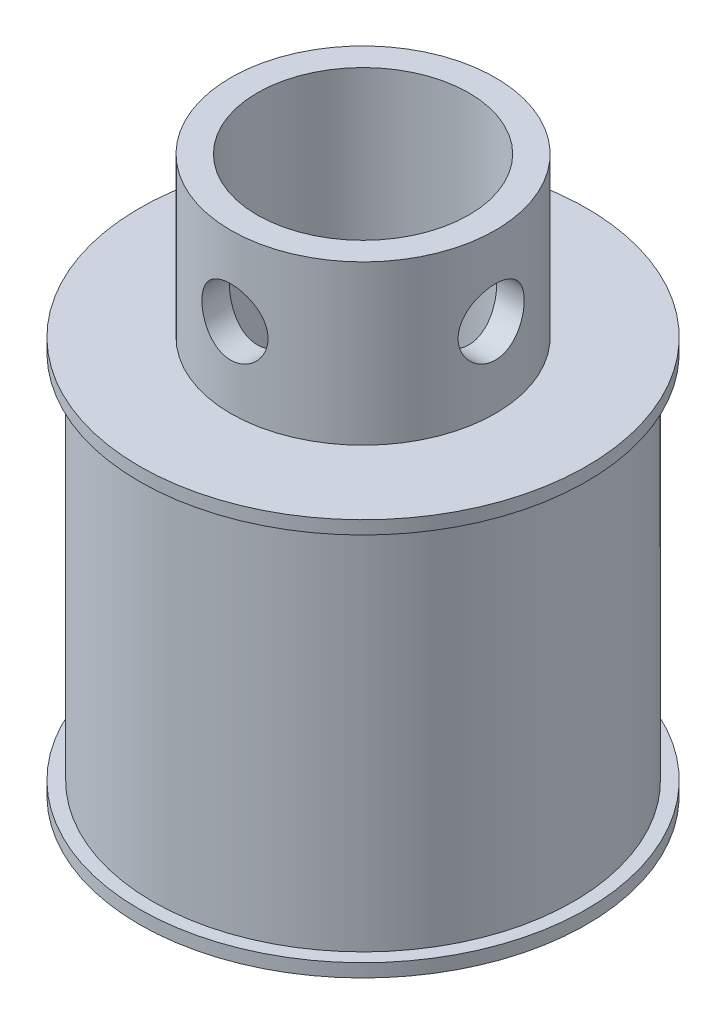
ISO-10303-21;
HEADER;
FILE_DESCRIPTION(('STEP AP214'),'2;1');
FILE_NAME('part.step','',(''),(''),'','','');
FILE_SCHEMA(('AUTOMOTIVE_DESIGN { 1 0 10303 214 1 1 1 1 }'));
ENDSEC;
DATA;
#1=APPLICATION_CONTEXT('core data for automotive mechanical design processes');
#2=APPLICATION_PROTOCOL_DEFINITION('international standard','automotive_design',2000,#1);
#3=PRODUCT_CONTEXT('',#1,'mechanical');
#4=PRODUCT('Part','Part','',(#3));
#5=PRODUCT_RELATED_PRODUCT_CATEGORY('part','',(#4));
#6=PRODUCT_DEFINITION_FORMATION('','',#4);
#7=PRODUCT_DEFINITION_CONTEXT('part definition',#1,'design');
#8=PRODUCT_DEFINITION('design','',#6,#7);
#9=PRODUCT_DEFINITION_SHAPE('','',#8);
#10=(LENGTH_UNIT() NAMED_UNIT(*) SI_UNIT(.MILLI.,.METRE.));
#11=(NAMED_UNIT(*) PLANE_ANGLE_UNIT() SI_UNIT($,.RADIAN.));
#12=(NAMED_UNIT(*) SI_UNIT($,.STERADIAN.) SOLID_ANGLE_UNIT());
#13=UNCERTAINTY_MEASURE_WITH_UNIT(LENGTH_MEASURE(1.E-05),#10,'distance_accuracy_value','');
#14=(GEOMETRIC_REPRESENTATION_CONTEXT(3) GLOBAL_UNCERTAINTY_ASSIGNED_CONTEXT((#13)) GLOBAL_UNIT_ASSIGNED_CONTEXT((#10,
#11,#12)) REPRESENTATION_CONTEXT('',''));
#15=CARTESIAN_POINT('',(0.,0.,0.));
#16=DIRECTION('',(0.,0.,1.));
#17=DIRECTION('',(1.,0.,0.));
#18=AXIS2_PLACEMENT_3D('',#15,#16,#17);
#19=CARTESIAN_POINT('',(0.,7.5,0.));
#20=DIRECTION('',(0.,-1.,0.));
#21=DIRECTION('',(0.,0.,-1.));
#22=AXIS2_PLACEMENT_3D('',#19,#20,#21);
#23=CYLINDRICAL_SURFACE('',#22,7.95);
#24=CARTESIAN_POINT('',(0.,-7.,0.));
#25=DIRECTION('',(0.,1.,0.));
#26=DIRECTION('',(0.,0.,1.));
#27=AXIS2_PLACEMENT_3D('',#24,#25,#26);
#28=CIRCLE('',#27,7.95);
#29=CARTESIAN_POINT('',(0.,-7.,7.95));
#30=VERTEX_POINT('',#29);
#31=EDGE_CURVE('E80',#30,#30,#28,.T.);
#32=ORIENTED_EDGE('',*,*,#31,.T.);
#33=EDGE_LOOP('',(#32));
#34=FACE_BOUND('',#33,.T.);
#35=CARTESIAN_POINT('',(0.,7.,0.));
#36=DIRECTION('',(0.,1.,0.));
#37=DIRECTION('',(0.,0.,1.));
#38=AXIS2_PLACEMENT_3D('',#35,#36,#37);
#39=CIRCLE('',#38,7.95);
#40=CARTESIAN_POINT('',(0.,7.,7.95));
#41=VERTEX_POINT('',#40);
#42=EDGE_CURVE('E12',#41,#41,#39,.T.);
#43=ORIENTED_EDGE('',*,*,#42,.F.);
#44=EDGE_LOOP('',(#43));
#45=FACE_BOUND('',#44,.T.);
#46=ADVANCED_FACE('F57',(#34,#45),#23,.T.);
#47=CARTESIAN_POINT('',(0.,7.,0.));
#48=DIRECTION('',(0.,1.,0.));
#49=DIRECTION('',(0.,0.,1.));
#50=AXIS2_PLACEMENT_3D('',#47,#48,#49);
#51=CYLINDRICAL_SURFACE('',#50,8.45);
#52=CARTESIAN_POINT('',(0.,7.,0.));
#53=DIRECTION('',(0.,1.,0.));
#54=DIRECTION('',(0.,0.,1.));
#55=AXIS2_PLACEMENT_3D('',#52,#53,#54);
#56=CIRCLE('',#55,8.45);
#57=CARTESIAN_POINT('',(0.,7.,8.45));
#58=VERTEX_POINT('',#57);
#59=EDGE_CURVE('E70',#58,#58,#56,.T.);
#60=ORIENTED_EDGE('',*,*,#59,.T.);
#61=EDGE_LOOP('',(#60));
#62=FACE_BOUND('',#61,.T.);
#63=CARTESIAN_POINT('',(0.,7.5,0.));
#64=DIRECTION('',(0.,1.,0.));
#65=DIRECTION('',(0.,0.,1.));
#66=AXIS2_PLACEMENT_3D('',#63,#64,#65);
#67=CIRCLE('',#66,8.45);
#68=CARTESIAN_POINT('',(0.,7.5,8.45));
#69=VERTEX_POINT('',#68);
#70=EDGE_CURVE('E77',#69,#69,#67,.T.);
#71=ORIENTED_EDGE('',*,*,#70,.F.);
#72=EDGE_LOOP('',(#71));
#73=FACE_BOUND('',#72,.T.);
#74=ADVANCED_FACE('F153',(#62,#73),#51,.T.);
#75=CARTESIAN_POINT('',(0.,7.,0.));
#76=DIRECTION('',(0.,1.,0.));
#77=DIRECTION('',(0.,0.,1.));
#78=AXIS2_PLACEMENT_3D('',#75,#76,#77);
#79=PLANE('',#78);
#80=ORIENTED_EDGE('',*,*,#42,.T.);
#81=EDGE_LOOP('',(#80));
#82=FACE_BOUND('',#81,.T.);
#83=ORIENTED_EDGE('',*,*,#59,.F.);
#84=EDGE_LOOP('',(#83));
#85=FACE_BOUND('',#84,.T.);
#86=ADVANCED_FACE('F159',(#82,#85),#79,.F.);
#87=CARTESIAN_POINT('',(0.,7.5,0.));
#88=DIRECTION('',(0.,1.,0.));
#89=DIRECTION('',(0.,0.,1.));
#90=AXIS2_PLACEMENT_3D('',#87,#88,#89);
#91=PLANE('',#90);
#92=CARTESIAN_POINT('',(0.,7.5,0.));
#93=DIRECTION('',(0.,1.,0.));
#94=DIRECTION('',(0.,0.,1.));
#95=AXIS2_PLACEMENT_3D('',#92,#93,#94);
#96=CIRCLE('',#95,5.);
#97=CARTESIAN_POINT('',(0.,7.5,5.));
#98=VERTEX_POINT('',#97);
#99=EDGE_CURVE('E98',#98,#98,#96,.F.);
#100=ORIENTED_EDGE('',*,*,#99,.T.);
#101=EDGE_LOOP('',(#100));
#102=FACE_BOUND('',#101,.T.);
#103=ORIENTED_EDGE('',*,*,#70,.T.);
#104=EDGE_LOOP('',(#103));
#105=FACE_BOUND('',#104,.T.);
#106=ADVANCED_FACE('F165',(#102,#105),#91,.T.);
#107=CARTESIAN_POINT('',(0.,-7.,0.));
#108=DIRECTION('',(0.,-1.,0.));
#109=DIRECTION('',(0.,0.,-1.));
#110=AXIS2_PLACEMENT_3D('',#107,#108,#109);
#111=CYLINDRICAL_SURFACE('',#110,8.45);
#112=CARTESIAN_POINT('',(0.,-7.,0.));
#113=DIRECTION('',(0.,1.,0.));
#114=DIRECTION('',(0.,0.,1.));
#115=AXIS2_PLACEMENT_3D('',#112,#113,#114);
#116=CIRCLE('',#115,8.45);
#117=CARTESIAN_POINT('',(0.,-7.,8.45));
#118=VERTEX_POINT('',#117);
#119=EDGE_CURVE('E83',#118,#118,#116,.T.);
#120=ORIENTED_EDGE('',*,*,#119,.F.);
#121=EDGE_LOOP('',(#120));
#122=FACE_BOUND('',#121,.T.);
#123=CARTESIAN_POINT('',(0.,-7.5,0.));
#124=DIRECTION('',(0.,1.,0.));
#125=DIRECTION('',(0.,0.,1.));
#126=AXIS2_PLACEMENT_3D('',#123,#124,#125);
#127=CIRCLE('',#126,8.45);
#128=CARTESIAN_POINT('',(0.,-7.5,8.45));
#129=VERTEX_POINT('',#128);
#130=EDGE_CURVE('E91',#129,#129,#127,.T.);
#131=ORIENTED_EDGE('',*,*,#130,.T.);
#132=EDGE_LOOP('',(#131));
#133=FACE_BOUND('',#132,.T.);
#134=ADVANCED_FACE('F171',(#122,#133),#111,.T.);
#135=CARTESIAN_POINT('',(0.,-7.,0.));
#136=DIRECTION('',(0.,1.,0.));
#137=DIRECTION('',(0.,0.,1.));
#138=AXIS2_PLACEMENT_3D('',#135,#136,#137);
#139=PLANE('',#138);
#140=ORIENTED_EDGE('',*,*,#31,.F.);
#141=EDGE_LOOP('',(#140));
#142=FACE_BOUND('',#141,.T.);
#143=ORIENTED_EDGE('',*,*,#119,.T.);
#144=EDGE_LOOP('',(#143));
#145=FACE_BOUND('',#144,.T.);
#146=ADVANCED_FACE('F176',(#142,#145),#139,.T.);
#147=CARTESIAN_POINT('',(0.,-7.5,0.));
#148=DIRECTION('',(0.,1.,0.));
#149=DIRECTION('',(0.,0.,1.));
#150=AXIS2_PLACEMENT_3D('',#147,#148,#149);
#151=PLANE('',#150);
#152=CARTESIAN_POINT('',(0.,-7.5,0.));
#153=DIRECTION('',(0.,-1.,0.));
#154=DIRECTION('',(0.,0.,-1.));
#155=AXIS2_PLACEMENT_3D('',#152,#153,#154);
#156=CIRCLE('',#155,4.);
#157=CARTESIAN_POINT('',(0.,-7.5,-4.));
#158=VERTEX_POINT('',#157);
#159=EDGE_CURVE('E139',#158,#158,#156,.T.);
#160=ORIENTED_EDGE('',*,*,#159,.F.);
#161=EDGE_LOOP('',(#160));
#162=FACE_BOUND('',#161,.T.);
#163=ORIENTED_EDGE('',*,*,#130,.F.);
#164=EDGE_LOOP('',(#163));
#165=FACE_BOUND('',#164,.T.);
#166=ADVANCED_FACE('F173',(#162,#165),#151,.F.);
#167=CARTESIAN_POINT('',(0.,13.5,0.));
#168=DIRECTION('',(0.,-1.,0.));
#169=DIRECTION('',(0.,0.,-1.));
#170=AXIS2_PLACEMENT_3D('',#167,#168,#169);
#171=CYLINDRICAL_SURFACE('',#170,5.);
#172=CARTESIAN_POINT('',(-1.25,10.5,4.84122918275927));
#173=CARTESIAN_POINT('',(-1.24999803929589,10.5690253754623,4.84123050042654));
#174=CARTESIAN_POINT('',(-1.24426312274865,10.638072449339,4.84272153006957));
#175=CARTESIAN_POINT('',(-1.22151156273207,10.774183789087,4.84850930996624));
#176=CARTESIAN_POINT('',(-1.2044883533711,10.8412468772342,4.85280769310907));
#177=CARTESIAN_POINT('',(-1.15974559981597,10.9714017690935,4.86369362297984));
#178=CARTESIAN_POINT('',(-1.13203986392723,11.0344985776928,4.87027821345204));
#179=CARTESIAN_POINT('',(-1.0667605706307,11.15515542627,4.88499096014404));
#180=CARTESIAN_POINT('',(-1.02918659428034,11.2127152310401,4.89311918189251));
#181=CARTESIAN_POINT('',(-0.944354213655936,11.3219308226311,4.91020358177806));
#182=CARTESIAN_POINT('',(-0.896918443852023,11.373446800175,4.91917298811515));
#183=CARTESIAN_POINT('',(-0.794091032050331,11.4678806971802,4.93681437757649));
#184=CARTESIAN_POINT('',(-0.738698647090152,11.5107978128109,4.94548633283195));
#185=CARTESIAN_POINT('',(-0.620572600539475,11.5873877338156,4.96170207760291));
#186=CARTESIAN_POINT('',(-0.557747288097558,11.6209231940807,4.96922843700296));
#187=CARTESIAN_POINT('',(-0.427131592146379,11.6769048220765,4.98215405962992));
#188=CARTESIAN_POINT('',(-0.359341942895968,11.6993526259578,4.98755363667172));
#189=CARTESIAN_POINT('',(-0.222179379377079,11.7320739172893,4.9955237942409));
#190=CARTESIAN_POINT('',(-0.152866359774486,11.7425848221633,4.99814946922157));
#191=CARTESIAN_POINT('',(-0.0134144096313835,11.7518791896378,5.00046797053649));
#192=CARTESIAN_POINT('',(0.0567243972690353,11.7506643861048,5.00016123048352));
#193=CARTESIAN_POINT('',(0.194190308965485,11.7367125748749,4.99669047476767));
#194=CARTESIAN_POINT('',(0.261545269501334,11.7242318374731,4.99359001170437));
#195=CARTESIAN_POINT('',(0.393172809267108,11.6885143649758,4.98495418262427));
#196=CARTESIAN_POINT('',(0.457445224213048,11.6652770573113,4.9794186869922));
#197=CARTESIAN_POINT('',(0.581758379377258,11.6084987146565,4.96643754850448));
#198=CARTESIAN_POINT('',(0.64175563720813,11.5748664776691,4.95897509847527));
#199=CARTESIAN_POINT('',(0.75534452792561,11.4983221604419,4.94294951904824));
#200=CARTESIAN_POINT('',(0.808935043856881,11.4554084657197,4.93438619826245));
#201=CARTESIAN_POINT('',(0.909717543856194,11.3601456290088,4.9168185688476));
#202=CARTESIAN_POINT('',(0.956697098843998,11.3075725538261,4.90780859762959));
#203=CARTESIAN_POINT('',(1.04122046995377,11.1952000132299,4.89057521758353));
#204=CARTESIAN_POINT('',(1.07876384505752,11.1354002102545,4.88235184552985));
#205=CARTESIAN_POINT('',(1.14348516127825,11.0098549829255,4.86760248415824));
#206=CARTESIAN_POINT('',(1.17061195871311,10.9440821348434,4.8610849186286));
#207=CARTESIAN_POINT('',(1.21335702579542,10.8087072659618,4.85059320069978));
#208=CARTESIAN_POINT('',(1.22897775819114,10.7391060680084,4.84661850405109));
#209=CARTESIAN_POINT('',(1.24791481933259,10.6000202492384,4.8417767801957));
#210=CARTESIAN_POINT('',(1.25154523695981,10.5305811033352,4.84083044546824));
#211=CARTESIAN_POINT('',(1.24725849525777,10.3920890317109,4.8419367174052));
#212=CARTESIAN_POINT('',(1.2393423989244,10.3230360710244,4.84398904800633));
#213=CARTESIAN_POINT('',(1.21246273196883,10.1884428675226,4.8507854097728));
#214=CARTESIAN_POINT('',(1.19368203414087,10.1228636367146,4.85548485117188));
#215=CARTESIAN_POINT('',(1.14580904083531,9.99578427107416,4.86700359135481));
#216=CARTESIAN_POINT('',(1.11671552385627,9.93428462047233,4.87382314124307));
#217=CARTESIAN_POINT('',(1.04838533396828,9.81577936106633,4.88898068546631));
#218=CARTESIAN_POINT('',(1.00896087691781,9.75888557997845,4.89734584303321));
#219=CARTESIAN_POINT('',(0.921325366168068,9.65240581859933,4.91458541535858));
#220=CARTESIAN_POINT('',(0.873112868506798,9.60282104167497,4.92345991364235));
#221=CARTESIAN_POINT('',(0.767828401230906,9.51109447871453,4.94098701515803));
#222=CARTESIAN_POINT('',(0.71056494066449,9.4691699687256,4.94962851030918));
#223=CARTESIAN_POINT('',(0.589628353368343,9.39553206652438,4.96548608306867));
#224=CARTESIAN_POINT('',(0.525955561196988,9.3638181416959,4.9727022350198));
#225=CARTESIAN_POINT('',(0.394447752163861,9.31177698273604,4.98485057869157));
#226=CARTESIAN_POINT('',(0.32664672628485,9.29136785781047,4.98979915011205));
#227=CARTESIAN_POINT('',(0.188437200398509,9.26226983269579,4.99692646697894));
#228=CARTESIAN_POINT('',(0.118029206301553,9.25357867063048,4.99910574696704));
#229=CARTESIAN_POINT('',(-0.0213544080541589,9.24829051303059,5.00042711761014));
#230=CARTESIAN_POINT('',(-0.0903172837075423,9.25137286363077,4.9996497360001));
#231=CARTESIAN_POINT('',(-0.226709370518425,9.26880978411792,4.9953237057178));
#232=CARTESIAN_POINT('',(-0.294138627226109,9.28316401876638,4.99177513946369));
#233=CARTESIAN_POINT('',(-0.425213794556021,9.32256527471366,4.98231791067453));
#234=CARTESIAN_POINT('',(-0.488878118226275,9.34755431664328,4.97642205628333));
#235=CARTESIAN_POINT('',(-0.611146316301836,9.40746322377416,4.9628911114173));
#236=CARTESIAN_POINT('',(-0.669749551581315,9.44238434083696,4.9552558017217));
#237=CARTESIAN_POINT('',(-0.781752410529875,9.52214404249635,4.93884062101666));
#238=CARTESIAN_POINT('',(-0.83499373537573,9.56720017863423,4.93003771182014));
#239=CARTESIAN_POINT('',(-0.933268775339069,9.66552856496725,4.91238311316553));
#240=CARTESIAN_POINT('',(-0.978300406335237,9.71880289512239,4.90353141190695));
#241=CARTESIAN_POINT('',(-1.05970253309904,9.83325176775167,4.88659344825685));
#242=CARTESIAN_POINT('',(-1.09589577430819,9.89455515426579,4.87852454662356));
#243=CARTESIAN_POINT('',(-1.15740862076958,10.0225693624034,4.8642994443827));
#244=CARTESIAN_POINT('',(-1.18273613719965,10.0892762076334,4.85814185308378));
#245=CARTESIAN_POINT('',(-1.2180281607068,10.2132212647834,4.84939885924729));
#246=CARTESIAN_POINT('',(-1.22999146324422,10.2698664554798,4.84635828750683));
#247=CARTESIAN_POINT('',(-1.24597786571658,10.38433608625,4.84227298231965));
#248=CARTESIAN_POINT('',(-1.25000164296523,10.4421604253063,4.84122807862454));
#249=CARTESIAN_POINT('',(-1.25,10.5,4.84122918275927));
#250=B_SPLINE_CURVE_WITH_KNOTS('',3,(#172,#173,#174,#175,#176,#177,#178,#179,#180,#181,#182,
#183,#184,#185,#186,#187,#188,#189,#190,#191,#192,#193,#194,#195,#196,#197,#198,#199,#200,#201,
#202,#203,#204,#205,#206,#207,#208,#209,#210,#211,#212,#213,#214,#215,#216,#217,#218,#219,#220,
#221,#222,#223,#224,#225,#226,#227,#228,#229,#230,#231,#232,#233,#234,#235,#236,#237,#238,#239,
#240,#241,#242,#243,#244,#245,#246,#247,#248,#249),.UNSPECIFIED.,.T.,.F.,(4,2,2,2,2,2,2,2,2,2,2,
2,2,2,2,2,2,2,2,2,2,2,2,2,2,2,2,2,2,2,2,2,2,2,2,2,2,2,4),(0.,0.206863720868071,
0.413847870714333,0.620565363583009,0.827291633777393,1.03811977096488,1.24896760739933,
1.4627574819896,1.67651579923546,1.88594375497673,2.0953407433301,2.30009131344473,
2.50485278362393,2.71146437127222,2.91811192734456,3.13035233285956,3.34260265599901,
3.55588216004201,3.76911600064773,3.97671787380858,4.18430063591901,4.38848702504603,
4.59269760710708,4.80091422929578,5.00916509442522,5.22262665482659,5.43607707859776,
5.64796036403464,5.85980274454519,6.06591723063728,6.2720255868849,6.47702438279855,
6.68204902869036,6.89198548291035,7.10197515782754,7.31588238642338,7.52963360683309,
7.70298913588665,7.8763298754976),.UNSPECIFIED.);
#251=CARTESIAN_POINT('',(-1.25,10.5,4.84122918275927));
#252=VERTEX_POINT('',#251);
#253=EDGE_CURVE('E117',#252,#252,#250,.T.);
#254=ORIENTED_EDGE('',*,*,#253,.T.);
#255=EDGE_LOOP('',(#254));
#256=FACE_BOUND('',#255,.T.);
#257=CARTESIAN_POINT('',(4.84122918275927,10.5,1.24999999999999));
#258=CARTESIAN_POINT('',(4.84123050042654,10.5690253754623,1.24999803929588));
#259=CARTESIAN_POINT('',(4.84272153006957,10.638072449339,1.24426312274864));
#260=CARTESIAN_POINT('',(4.84850930996624,10.774183789087,1.22151156273206));
#261=CARTESIAN_POINT('',(4.85280769310907,10.8412468772342,1.20448835337109));
#262=CARTESIAN_POINT('',(4.86369362297984,10.9714017690935,1.15974559981597));
#263=CARTESIAN_POINT('',(4.87027821345204,11.0344985776928,1.13203986392723));
#264=CARTESIAN_POINT('',(4.88499096014404,11.15515542627,1.0667605706307));
#265=CARTESIAN_POINT('',(4.89311918189251,11.2127152310401,1.02918659428034));
#266=CARTESIAN_POINT('',(4.91020358177806,11.3219308226311,0.944354213655932));
#267=CARTESIAN_POINT('',(4.91917298811515,11.373446800175,0.89691844385202));
#268=CARTESIAN_POINT('',(4.93681437757649,11.4678806971802,0.794091032050328));
#269=CARTESIAN_POINT('',(4.94548633283195,11.5107978128109,0.738698647090149));
#270=CARTESIAN_POINT('',(4.96170207760291,11.5873877338156,0.620572600539473));
#271=CARTESIAN_POINT('',(4.96922843700296,11.6209231940807,0.557747288097556));
#272=CARTESIAN_POINT('',(4.98215405962992,11.6769048220765,0.427131592146378));
#273=CARTESIAN_POINT('',(4.98755363667172,11.6993526259578,0.359341942895968));
#274=CARTESIAN_POINT('',(4.9955237942409,11.7320739172893,0.222179379377079));
#275=CARTESIAN_POINT('',(4.99814946922157,11.7425848221633,0.152866359774486));
#276=CARTESIAN_POINT('',(5.00046797053649,11.7518791896378,0.0134144096313839));
#277=CARTESIAN_POINT('',(5.00016123048352,11.7506643861048,-0.0567243972690349));
#278=CARTESIAN_POINT('',(4.99669047476767,11.7367125748749,-0.194190308965484));
#279=CARTESIAN_POINT('',(4.99359001170437,11.7242318374731,-0.261545269501333));
#280=CARTESIAN_POINT('',(4.98495418262427,11.6885143649757,-0.393172809267106));
#281=CARTESIAN_POINT('',(4.9794186869922,11.6652770573113,-0.457445224213046));
#282=CARTESIAN_POINT('',(4.96643754850448,11.6084987146565,-0.581758379377256));
#283=CARTESIAN_POINT('',(4.95897509847527,11.5748664776691,-0.641755637208128));
#284=CARTESIAN_POINT('',(4.94294951904825,11.4983221604419,-0.755344527925608));
#285=CARTESIAN_POINT('',(4.93438619826245,11.4554084657197,-0.808935043856878));
#286=CARTESIAN_POINT('',(4.9168185688476,11.3601456290088,-0.909717543856191));
#287=CARTESIAN_POINT('',(4.90780859762959,11.3075725538261,-0.956697098843995));
#288=CARTESIAN_POINT('',(4.89057521758353,11.1952000132299,-1.04122046995377));
#289=CARTESIAN_POINT('',(4.88235184552985,11.1354002102545,-1.07876384505752));
#290=CARTESIAN_POINT('',(4.86760248415824,11.0098549829255,-1.14348516127824));
#291=CARTESIAN_POINT('',(4.8610849186286,10.9440821348434,-1.17061195871311));
#292=CARTESIAN_POINT('',(4.85059320069979,10.8087072659618,-1.21335702579542));
#293=CARTESIAN_POINT('',(4.84661850405109,10.7391060680084,-1.22897775819113));
#294=CARTESIAN_POINT('',(4.84177678019571,10.6000202492384,-1.24791481933258));
#295=CARTESIAN_POINT('',(4.84083044546824,10.5305811033352,-1.25154523695981));
#296=CARTESIAN_POINT('',(4.8419367174052,10.3920890317109,-1.24725849525777));
#297=CARTESIAN_POINT('',(4.84398904800633,10.3230360710244,-1.23934239892439));
#298=CARTESIAN_POINT('',(4.8507854097728,10.1884428675226,-1.21246273196882));
#299=CARTESIAN_POINT('',(4.85548485117188,10.1228636367146,-1.19368203414087));
#300=CARTESIAN_POINT('',(4.86700359135481,9.99578427107416,-1.1458090408353));
#301=CARTESIAN_POINT('',(4.87382314124307,9.93428462047234,-1.11671552385627));
#302=CARTESIAN_POINT('',(4.88898068546631,9.81577936106633,-1.04838533396827));
#303=CARTESIAN_POINT('',(4.89734584303321,9.75888557997846,-1.00896087691781));
#304=CARTESIAN_POINT('',(4.91458541535858,9.65240581859933,-0.921325366168064));
#305=CARTESIAN_POINT('',(4.92345991364235,9.60282104167497,-0.873112868506794));
#306=CARTESIAN_POINT('',(4.94098701515803,9.51109447871453,-0.767828401230902));
#307=CARTESIAN_POINT('',(4.94962851030918,9.4691699687256,-0.710564940664486));
#308=CARTESIAN_POINT('',(4.96548608306867,9.39553206652439,-0.58962835336834));
#309=CARTESIAN_POINT('',(4.9727022350198,9.3638181416959,-0.525955561196985));
#310=CARTESIAN_POINT('',(4.98485057869157,9.31177698273604,-0.39444775216386));
#311=CARTESIAN_POINT('',(4.98979915011205,9.29136785781048,-0.326646726284849));
#312=CARTESIAN_POINT('',(4.99692646697894,9.2622698326958,-0.188437200398508));
#313=CARTESIAN_POINT('',(4.99910574696704,9.25357867063048,-0.118029206301553));
#314=CARTESIAN_POINT('',(5.00042711761014,9.24829051303059,0.0213544080541585));
#315=CARTESIAN_POINT('',(4.9996497360001,9.25137286363077,0.0903172837075417));
#316=CARTESIAN_POINT('',(4.9953237057178,9.26880978411793,0.226709370518424));
#317=CARTESIAN_POINT('',(4.99177513946369,9.28316401876639,0.294138627226108));
#318=CARTESIAN_POINT('',(4.98231791067453,9.32256527471367,0.425213794556019));
#319=CARTESIAN_POINT('',(4.97642205628333,9.34755431664329,0.488878118226272));
#320=CARTESIAN_POINT('',(4.9628911114173,9.40746322377417,0.611146316301833));
#321=CARTESIAN_POINT('',(4.9552558017217,9.44238434083697,0.669749551581312));
#322=CARTESIAN_POINT('',(4.93884062101666,9.52214404249635,0.781752410529871));
#323=CARTESIAN_POINT('',(4.93003771182014,9.56720017863423,0.834993735375726));
#324=CARTESIAN_POINT('',(4.91238311316553,9.66552856496726,0.933268775339064));
#325=CARTESIAN_POINT('',(4.90353141190695,9.71880289512239,0.978300406335232));
#326=CARTESIAN_POINT('',(4.88659344825685,9.83325176775167,1.05970253309903));
#327=CARTESIAN_POINT('',(4.87852454662356,9.89455515426579,1.09589577430818));
#328=CARTESIAN_POINT('',(4.8642994443827,10.0225693624034,1.15740862076958));
#329=CARTESIAN_POINT('',(4.85814185308379,10.0892762076334,1.18273613719964));
#330=CARTESIAN_POINT('',(4.84939885924729,10.2132212647834,1.21802816070679));
#331=CARTESIAN_POINT('',(4.84635828750684,10.2698664554798,1.22999146324422));
#332=CARTESIAN_POINT('',(4.84227298231965,10.38433608625,1.24597786571658));
#333=CARTESIAN_POINT('',(4.84122807862454,10.4421604253063,1.25000164296522));
#334=CARTESIAN_POINT('',(4.84122918275927,10.5,1.24999999999999));
#335=B_SPLINE_CURVE_WITH_KNOTS('',3,(#257,#258,#259,#260,#261,#262,#263,#264,#265,#266,#267,
#268,#269,#270,#271,#272,#273,#274,#275,#276,#277,#278,#279,#280,#281,#282,#283,#284,#285,#286,
#287,#288,#289,#290,#291,#292,#293,#294,#295,#296,#297,#298,#299,#300,#301,#302,#303,#304,#305,
#306,#307,#308,#309,#310,#311,#312,#313,#314,#315,#316,#317,#318,#319,#320,#321,#322,#323,#324,
#325,#326,#327,#328,#329,#330,#331,#332,#333,#334),.UNSPECIFIED.,.T.,.F.,(4,2,2,2,2,2,2,2,2,2,2,
2,2,2,2,2,2,2,2,2,2,2,2,2,2,2,2,2,2,2,2,2,2,2,2,2,2,2,4),(0.,0.206863720868068,
0.413847870714331,0.620565363583005,0.827291633777387,1.03811977096488,1.24896760739933,
1.46275748198959,1.67651579923545,1.88594375497672,2.09534074333009,2.30009131344472,
2.50485278362392,2.71146437127221,2.91811192734455,3.13035233285954,3.34260265599899,
3.55588216004199,3.76911600064772,3.97671787380856,4.18430063591899,4.38848702504601,
4.59269760710706,4.80091422929576,5.0091650944252,5.22262665482657,5.43607707859774,
5.64796036403462,5.85980274454516,6.06591723063725,6.27202558688487,6.47702438279852,
6.68204902869033,6.89198548291032,7.10197515782751,7.31588238642335,7.52963360683306,
7.70298913588661,7.87632987549756),.UNSPECIFIED.);
#336=CARTESIAN_POINT('',(4.84122918275927,10.5,1.24999999999999));
#337=VERTEX_POINT('',#336);
#338=EDGE_CURVE('E108',#337,#337,#335,.T.);
#339=ORIENTED_EDGE('',*,*,#338,.T.);
#340=EDGE_LOOP('',(#339));
#341=FACE_BOUND('',#340,.T.);
#342=ORIENTED_EDGE('',*,*,#99,.F.);
#343=EDGE_LOOP('',(#342));
#344=FACE_BOUND('',#343,.T.);
#345=CARTESIAN_POINT('',(0.,13.5,0.));
#346=DIRECTION('',(0.,1.,0.));
#347=DIRECTION('',(0.,0.,1.));
#348=AXIS2_PLACEMENT_3D('',#345,#346,#347);
#349=CIRCLE('',#348,5.);
#350=CARTESIAN_POINT('',(0.,13.5,5.));
#351=VERTEX_POINT('',#350);
#352=EDGE_CURVE('E104',#351,#351,#349,.T.);
#353=ORIENTED_EDGE('',*,*,#352,.F.);
#354=EDGE_LOOP('',(#353));
#355=FACE_BOUND('',#354,.T.);
#356=ADVANCED_FACE('F175',(#256,#341,#344,#355),#171,.T.);
#357=CARTESIAN_POINT('',(0.,13.5,0.));
#358=DIRECTION('',(0.,1.,0.));
#359=DIRECTION('',(0.,0.,1.));
#360=AXIS2_PLACEMENT_3D('',#357,#358,#359);
#361=PLANE('',#360);
#362=CARTESIAN_POINT('',(0.,13.5,0.));
#363=DIRECTION('',(0.,-1.,0.));
#364=DIRECTION('',(0.,0.,-1.));
#365=AXIS2_PLACEMENT_3D('',#362,#363,#364);
#366=CIRCLE('',#365,4.);
#367=CARTESIAN_POINT('',(0.,13.5,-4.));
#368=VERTEX_POINT('',#367);
#369=EDGE_CURVE('E202',#368,#368,#366,.T.);
#370=ORIENTED_EDGE('',*,*,#369,.T.);
#371=EDGE_LOOP('',(#370));
#372=FACE_BOUND('',#371,.T.);
#373=ORIENTED_EDGE('',*,*,#352,.T.);
#374=EDGE_LOOP('',(#373));
#375=FACE_BOUND('',#374,.T.);
#376=ADVANCED_FACE('F129',(#372,#375),#361,.T.);
#377=CARTESIAN_POINT('',(0.,10.5,0.));
#378=DIRECTION('',(-1.,0.,0.));
#379=DIRECTION('',(0.,0.,1.));
#380=AXIS2_PLACEMENT_3D('',#377,#378,#379);
#381=CYLINDRICAL_SURFACE('',#380,1.24999999999999);
#382=CARTESIAN_POINT('',(3.79967103839267,10.5,1.24999999999999));
#383=CARTESIAN_POINT('',(3.79967145961936,10.5683470361093,1.24999953780046));
#384=CARTESIAN_POINT('',(3.80153531505043,10.6366987687032,1.24437538791494));
#385=CARTESIAN_POINT('',(3.80875638998877,10.7713941608778,1.22209175401326));
#386=CARTESIAN_POINT('',(3.81411455353136,10.8377372727322,1.20542928782514));
#387=CARTESIAN_POINT('',(3.8276593883596,10.966444901932,1.16169788223558));
#388=CARTESIAN_POINT('',(3.83584105194317,11.0288162331057,1.13464735736676));
#389=CARTESIAN_POINT('',(3.85410406218688,11.148152695864,1.07096914173156));
#390=CARTESIAN_POINT('',(3.86418574435841,11.2051168699601,1.03433975905631));
#391=CARTESIAN_POINT('',(3.8855012766862,11.3139788674935,0.951196070622287));
#392=CARTESIAN_POINT('',(3.8967612338478,11.365663609436,0.904409399720392));
#393=CARTESIAN_POINT('',(3.91894245860336,11.4605960132092,0.802862046455489));
#394=CARTESIAN_POINT('',(3.92986367872627,11.5038424969448,0.748100252518559));
#395=CARTESIAN_POINT('',(3.95043553390078,11.5816110630112,0.630625912493358));
#396=CARTESIAN_POINT('',(3.9600518456278,11.6159137038315,0.567761556520091));
#397=CARTESIAN_POINT('',(3.97662551833019,11.6733760498555,0.436804232853401));
#398=CARTESIAN_POINT('',(3.98358350419919,11.6965383741496,0.368712498487049));
#399=CARTESIAN_POINT('',(3.99387175820863,11.7303511280971,0.231464356966096));
#400=CARTESIAN_POINT('',(3.99730738984143,11.7413657497878,0.162405715468214));
#401=CARTESIAN_POINT('',(4.00053595876015,11.7517243464375,0.0233408139845197));
#402=CARTESIAN_POINT('',(4.00032972410065,11.7510709743588,-0.0466652269730837));
#403=CARTESIAN_POINT('',(3.99637116132537,11.7383517084141,-0.183074480354734));
#404=CARTESIAN_POINT('',(3.99274150972157,11.726680616487,-0.249518634314043));
#405=CARTESIAN_POINT('',(3.98249482560855,11.692905009957,-0.379453063347768));
#406=CARTESIAN_POINT('',(3.97587759827134,11.6707998149134,-0.442943145481194));
#407=CARTESIAN_POINT('',(3.96023459729533,11.6165298109251,-0.566078103154779));
#408=CARTESIAN_POINT('',(3.95118033616957,11.584245191437,-0.625666405622828));
#409=CARTESIAN_POINT('',(3.93161722953562,11.5106289002954,-0.738702511152026));
#410=CARTESIAN_POINT('',(3.92110801644584,11.4692949408622,-0.792148756208834));
#411=CARTESIAN_POINT('',(3.89923670734647,11.3767263651987,-0.893737698453877));
#412=CARTESIAN_POINT('',(3.88785731989084,11.3251509311588,-0.941566549094174));
#413=CARTESIAN_POINT('',(3.86590615440413,11.2146048981755,-1.02798974259537));
#414=CARTESIAN_POINT('',(3.85533447159847,11.155633429425,-1.06658299775341));
#415=CARTESIAN_POINT('',(3.83610846648974,11.0310825311402,-1.13380465019765));
#416=CARTESIAN_POINT('',(3.82747690354324,10.9654365909576,-1.16231680702681));
#417=CARTESIAN_POINT('',(3.81337545338913,10.8299405081047,-1.20778345948513));
#418=CARTESIAN_POINT('',(3.80790443033294,10.7600918857895,-1.22474210765793));
#419=CARTESIAN_POINT('',(3.80099563391872,10.6211800474342,-1.24601485185708));
#420=CARTESIAN_POINT('',(3.79940466389696,10.5521980037679,-1.2508095435371));
#421=CARTESIAN_POINT('',(3.80001077463985,10.4144102585018,-1.24896744498306));
#422=CARTESIAN_POINT('',(3.8022072700839,10.3456045312995,-1.24233242111455));
#423=CARTESIAN_POINT('',(3.80998957482875,10.2121917033484,-1.21824873513143));
#424=CARTESIAN_POINT('',(3.81547554101732,10.147520725926,-1.20111831160537));
#425=CARTESIAN_POINT('',(3.82911287331661,10.021978208004,-1.15690373661027));
#426=CARTESIAN_POINT('',(3.83726467412388,9.96110728907881,-1.12981796171154));
#427=CARTESIAN_POINT('',(3.85560539653156,9.84296089022826,-1.06557510655874));
#428=CARTESIAN_POINT('',(3.86584603489733,9.78583858440723,-1.02815147488557));
#429=CARTESIAN_POINT('',(3.88710348972829,9.67850965363809,-0.944606408679806));
#430=CARTESIAN_POINT('',(3.89812050735703,9.62830483107467,-0.898482714690778));
#431=CARTESIAN_POINT('',(3.92024187562679,9.53408963408719,-0.796572947753599));
#432=CARTESIAN_POINT('',(3.9313309228568,9.49042221386014,-0.740465649788516));
#433=CARTESIAN_POINT('',(3.95189059843678,9.41310895667875,-0.621451545651394));
#434=CARTESIAN_POINT('',(3.96136130090946,9.37946266068897,-0.55854505110862));
#435=CARTESIAN_POINT('',(3.97756311928512,9.32346943752833,-0.428105523331829));
#436=CARTESIAN_POINT('',(3.984313995612,9.30104071215633,-0.360610184283753));
#437=CARTESIAN_POINT('',(3.99440242648576,9.2679274614103,-0.222557254056388));
#438=CARTESIAN_POINT('',(3.99774104914277,9.25723926091651,-0.152000628340355));
#439=CARTESIAN_POINT('',(4.00055803404462,9.24820899825039,-0.0129849366488983));
#440=CARTESIAN_POINT('',(4.0001912940739,9.24937154982925,0.0554391919465226));
#441=CARTESIAN_POINT('',(3.99600978081049,9.2628118110487,0.191073221923248));
#442=CARTESIAN_POINT('',(3.99219523232619,9.27508879599196,0.258283202179568));
#443=CARTESIAN_POINT('',(3.98159570844796,9.31009400922228,0.38875511848079));
#444=CARTESIAN_POINT('',(3.97484847960205,9.33268960784538,0.45205591844948));
#445=CARTESIAN_POINT('',(3.9590794558795,9.38757082720849,0.573998425500089));
#446=CARTESIAN_POINT('',(3.95005727091358,9.41985810997344,0.632639331274479));
#447=CARTESIAN_POINT('',(3.93029896883376,9.49447275834445,0.745761694969685));
#448=CARTESIAN_POINT('',(3.91951509750962,9.53710352246398,0.800034607053108));
#449=CARTESIAN_POINT('',(3.89758736547061,9.63065988944347,0.900820791399316));
#450=CARTESIAN_POINT('',(3.88644339784827,9.6815879741394,0.947331733504156));
#451=CARTESIAN_POINT('',(3.86461892577438,9.79231571984111,1.03282865911252));
#452=CARTESIAN_POINT('',(3.85396600863456,9.85235340311658,1.07151427994711));
#453=CARTESIAN_POINT('',(3.83480125279531,9.97839812026915,1.13820470748521));
#454=CARTESIAN_POINT('',(3.82628854861387,10.0444027264503,1.16621383403545));
#455=CARTESIAN_POINT('',(3.81306560440328,10.1747226173147,1.20871180435792));
#456=CARTESIAN_POINT('',(3.80809315043749,10.2387025474516,1.22414939837873));
#457=CARTESIAN_POINT('',(3.80139606482399,10.3684538320965,1.24479245816099));
#458=CARTESIAN_POINT('',(3.79967063301598,10.4342247412015,1.25000044480778));
#459=CARTESIAN_POINT('',(3.79967103839267,10.5,1.24999999999999));
#460=B_SPLINE_CURVE_WITH_KNOTS('',3,(#382,#383,#384,#385,#386,#387,#388,#389,#390,#391,#392,
#393,#394,#395,#396,#397,#398,#399,#400,#401,#402,#403,#404,#405,#406,#407,#408,#409,#410,#411,
#412,#413,#414,#415,#416,#417,#418,#419,#420,#421,#422,#423,#424,#425,#426,#427,#428,#429,#430,
#431,#432,#433,#434,#435,#436,#437,#438,#439,#440,#441,#442,#443,#444,#445,#446,#447,#448,#449,
#450,#451,#452,#453,#454,#455,#456,#457,#458,#459),.UNSPECIFIED.,.T.,.F.,(4,2,2,2,2,2,2,2,2,2,2,
2,2,2,2,2,2,2,2,2,2,2,2,2,2,2,2,2,2,2,2,2,2,2,2,2,2,2,4),(0.,0.204798137548489,
0.409651627059734,0.61414364411858,0.818671804924945,1.02957080550838,1.24049922941122,
1.45619821963732,1.67184647417921,1.88083722835533,2.08978046471773,2.29150982969749,
2.49325235190092,2.69746404608408,2.90172742713186,3.11450338937333,3.32730439853774,
3.54248470934452,3.75758763952751,3.96404933287934,4.17047912219087,4.37093972044361,
4.57143302253208,4.77767613309608,4.98397288011878,5.19881937811508,5.41365603317084,
5.62690239290995,5.84008198140582,6.04438802439522,6.24868074692303,6.45041846514756,
6.65219079911649,6.86080693105212,7.06948557772187,7.28507795501701,7.50058300803818,
7.69772354371382,7.89481549188775),.UNSPECIFIED.);
#461=CARTESIAN_POINT('',(3.79967103839267,10.5,1.24999999999999));
#462=VERTEX_POINT('',#461);
#463=EDGE_CURVE('E133',#462,#462,#460,.T.);
#464=ORIENTED_EDGE('',*,*,#463,.T.);
#465=EDGE_LOOP('',(#464));
#466=FACE_BOUND('',#465,.T.);
#467=ORIENTED_EDGE('',*,*,#338,.F.);
#468=EDGE_LOOP('',(#467));
#469=FACE_BOUND('',#468,.T.);
#470=ADVANCED_FACE('F125',(#466,#469),#381,.F.);
#471=CARTESIAN_POINT('',(0.,10.5,0.));
#472=DIRECTION('',(0.,0.,-1.));
#473=DIRECTION('',(-1.,0.,0.));
#474=AXIS2_PLACEMENT_3D('',#471,#472,#473);
#475=CYLINDRICAL_SURFACE('',#474,1.25);
#476=CARTESIAN_POINT('',(-1.25,10.5,3.79967103839267));
#477=CARTESIAN_POINT('',(-1.24999953780047,10.5683470361093,3.79967145961936));
#478=CARTESIAN_POINT('',(-1.24437538791494,10.6366987687032,3.80153531505043));
#479=CARTESIAN_POINT('',(-1.22209175401327,10.7713941608778,3.80875638998877));
#480=CARTESIAN_POINT('',(-1.20542928782515,10.8377372727322,3.81411455353136));
#481=CARTESIAN_POINT('',(-1.16169788223559,10.966444901932,3.8276593883596));
#482=CARTESIAN_POINT('',(-1.13464735736677,11.0288162331057,3.83584105194317));
#483=CARTESIAN_POINT('',(-1.07096914173157,11.148152695864,3.85410406218688));
#484=CARTESIAN_POINT('',(-1.03433975905632,11.2051168699601,3.86418574435841));
#485=CARTESIAN_POINT('',(-0.951196070622292,11.3139788674935,3.8855012766862));
#486=CARTESIAN_POINT('',(-0.904409399720398,11.365663609436,3.8967612338478));
#487=CARTESIAN_POINT('',(-0.802862046455495,11.4605960132092,3.91894245860336));
#488=CARTESIAN_POINT('',(-0.748100252518565,11.5038424969448,3.92986367872627));
#489=CARTESIAN_POINT('',(-0.630625912493362,11.5816110630112,3.95043553390078));
#490=CARTESIAN_POINT('',(-0.567761556520094,11.6159137038315,3.9600518456278));
#491=CARTESIAN_POINT('',(-0.436804232853402,11.6733760498556,3.97662551833019));
#492=CARTESIAN_POINT('',(-0.36871249848705,11.6965383741496,3.98358350419919));
#493=CARTESIAN_POINT('',(-0.231464356966096,11.7303511280971,3.99387175820863));
#494=CARTESIAN_POINT('',(-0.162405715468213,11.7413657497879,3.99730738984143));
#495=CARTESIAN_POINT('',(-0.0233408139845186,11.7517243464375,4.00053595876015));
#496=CARTESIAN_POINT('',(0.046665226973085,11.7510709743588,4.00032972410065));
#497=CARTESIAN_POINT('',(0.183074480354736,11.7383517084141,3.99637116132537));
#498=CARTESIAN_POINT('',(0.249518634314045,11.726680616487,3.99274150972157));
#499=CARTESIAN_POINT('',(0.379453063347771,11.692905009957,3.98249482560855));
#500=CARTESIAN_POINT('',(0.442943145481196,11.6707998149134,3.97587759827134));
#501=CARTESIAN_POINT('',(0.566078103154782,11.6165298109251,3.96023459729533));
#502=CARTESIAN_POINT('',(0.625666405622831,11.584245191437,3.95118033616957));
#503=CARTESIAN_POINT('',(0.738702511152029,11.5106289002954,3.93161722953562));
#504=CARTESIAN_POINT('',(0.792148756208838,11.4692949408622,3.92110801644584));
#505=CARTESIAN_POINT('',(0.893737698453881,11.3767263651987,3.89923670734646));
#506=CARTESIAN_POINT('',(0.941566549094179,11.3251509311588,3.88785731989084));
#507=CARTESIAN_POINT('',(1.02798974259538,11.2146048981755,3.86590615440412));
#508=CARTESIAN_POINT('',(1.06658299775341,11.155633429425,3.85533447159847));
#509=CARTESIAN_POINT('',(1.13380465019766,11.0310825311402,3.83610846648974));
#510=CARTESIAN_POINT('',(1.16231680702682,10.9654365909576,3.82747690354324));
#511=CARTESIAN_POINT('',(1.20778345948513,10.8299405081047,3.81337545338913));
#512=CARTESIAN_POINT('',(1.22474210765793,10.7600918857895,3.80790443033294));
#513=CARTESIAN_POINT('',(1.24601485185709,10.6211800474342,3.80099563391872));
#514=CARTESIAN_POINT('',(1.25080954353711,10.5521980037679,3.79940466389696));
#515=CARTESIAN_POINT('',(1.24896744498307,10.4144102585018,3.80001077463984));
#516=CARTESIAN_POINT('',(1.24233242111456,10.3456045312995,3.80220727008389));
#517=CARTESIAN_POINT('',(1.21824873513143,10.2121917033484,3.80998957482874));
#518=CARTESIAN_POINT('',(1.20111831160537,10.147520725926,3.81547554101732));
#519=CARTESIAN_POINT('',(1.15690373661027,10.021978208004,3.82911287331661));
#520=CARTESIAN_POINT('',(1.12981796171154,9.96110728907881,3.83726467412388));
#521=CARTESIAN_POINT('',(1.06557510655874,9.84296089022825,3.85560539653156));
#522=CARTESIAN_POINT('',(1.02815147488557,9.78583858440722,3.86584603489733));
#523=CARTESIAN_POINT('',(0.944606408679808,9.67850965363808,3.88710348972829));
#524=CARTESIAN_POINT('',(0.898482714690781,9.62830483107466,3.89812050735703));
#525=CARTESIAN_POINT('',(0.796572947753601,9.53408963408719,3.92024187562679));
#526=CARTESIAN_POINT('',(0.740465649788517,9.49042221386014,3.9313309228568));
#527=CARTESIAN_POINT('',(0.621451545651395,9.41310895667875,3.95189059843678));
#528=CARTESIAN_POINT('',(0.558545051108621,9.37946266068897,3.96136130090946));
#529=CARTESIAN_POINT('',(0.42810552333183,9.32346943752832,3.97756311928512));
#530=CARTESIAN_POINT('',(0.360610184283754,9.30104071215632,3.984313995612));
#531=CARTESIAN_POINT('',(0.222557254056388,9.2679274614103,3.99440242648576));
#532=CARTESIAN_POINT('',(0.152000628340355,9.25723926091651,3.99774104914277));
#533=CARTESIAN_POINT('',(0.0129849366488977,9.24820899825038,4.00055803404462));
#534=CARTESIAN_POINT('',(-0.0554391919465232,9.24937154982925,4.0001912940739));
#535=CARTESIAN_POINT('',(-0.191073221923249,9.2628118110487,3.99600978081049));
#536=CARTESIAN_POINT('',(-0.258283202179569,9.27508879599195,3.99219523232619));
#537=CARTESIAN_POINT('',(-0.388755118480792,9.31009400922228,3.98159570844796));
#538=CARTESIAN_POINT('',(-0.452055918449482,9.33268960784537,3.97484847960205));
#539=CARTESIAN_POINT('',(-0.573998425500092,9.38757082720848,3.9590794558795));
#540=CARTESIAN_POINT('',(-0.632639331274483,9.41985810997343,3.95005727091358));
#541=CARTESIAN_POINT('',(-0.74576169496969,9.49447275834444,3.93029896883376));
#542=CARTESIAN_POINT('',(-0.800034607053112,9.53710352246398,3.91951509750962));
#543=CARTESIAN_POINT('',(-0.90082079139932,9.63065988944347,3.89758736547061));
#544=CARTESIAN_POINT('',(-0.947331733504161,9.68158797413939,3.88644339784826));
#545=CARTESIAN_POINT('',(-1.03282865911253,9.7923157198411,3.86461892577438));
#546=CARTESIAN_POINT('',(-1.07151427994711,9.85235340311658,3.85396600863456));
#547=CARTESIAN_POINT('',(-1.13820470748522,9.97839812026914,3.83480125279531));
#548=CARTESIAN_POINT('',(-1.16621383403546,10.0444027264503,3.82628854861386));
#549=CARTESIAN_POINT('',(-1.20871180435792,10.1747226173147,3.81306560440328));
#550=CARTESIAN_POINT('',(-1.22414939837873,10.2387025474516,3.80809315043749));
#551=CARTESIAN_POINT('',(-1.244792458161,10.3684538320965,3.80139606482399));
#552=CARTESIAN_POINT('',(-1.25000044480778,10.4342247412015,3.79967063301598));
#553=CARTESIAN_POINT('',(-1.25,10.5,3.79967103839267));
#554=B_SPLINE_CURVE_WITH_KNOTS('',3,(#476,#477,#478,#479,#480,#481,#482,#483,#484,#485,#486,
#487,#488,#489,#490,#491,#492,#493,#494,#495,#496,#497,#498,#499,#500,#501,#502,#503,#504,#505,
#506,#507,#508,#509,#510,#511,#512,#513,#514,#515,#516,#517,#518,#519,#520,#521,#522,#523,#524,
#525,#526,#527,#528,#529,#530,#531,#532,#533,#534,#535,#536,#537,#538,#539,#540,#541,#542,#543,
#544,#545,#546,#547,#548,#549,#550,#551,#552,#553),.UNSPECIFIED.,.T.,.F.,(4,2,2,2,2,2,2,2,2,2,2,
2,2,2,2,2,2,2,2,2,2,2,2,2,2,2,2,2,2,2,2,2,2,2,2,2,2,2,4),(0.,0.20479813754849,0.409651627059736,
0.614143644118581,0.818671804924948,1.02957080550838,1.24049922941123,1.45619821963733,
1.67184647417922,1.88083722835534,2.08978046471774,2.2915098296975,2.49325235190093,
2.69746404608409,2.90172742713188,3.11450338937334,3.32730439853776,3.54248470934454,
3.75758763952753,3.96404933287936,4.17047912219089,4.37093972044363,4.5714330225321,
4.77767613309611,4.9839728801188,5.19881937811511,5.41365603317086,5.62690239290998,
5.84008198140585,6.04438802439525,6.24868074692307,6.45041846514759,6.65219079911652,
6.86080693105215,7.0694855777219,7.28507795501704,7.50058300803822,7.69772354371386,
7.89481549188779),.UNSPECIFIED.);
#555=CARTESIAN_POINT('',(-1.25,10.5,3.79967103839267));
#556=VERTEX_POINT('',#555);
#557=EDGE_CURVE('E60',#556,#556,#554,.T.);
#558=ORIENTED_EDGE('',*,*,#557,.T.);
#559=EDGE_LOOP('',(#558));
#560=FACE_BOUND('',#559,.T.);
#561=ORIENTED_EDGE('',*,*,#253,.F.);
#562=EDGE_LOOP('',(#561));
#563=FACE_BOUND('',#562,.T.);
#564=ADVANCED_FACE('F128',(#560,#563),#475,.F.);
#565=CARTESIAN_POINT('',(0.,13.5,0.));
#566=DIRECTION('',(0.,-1.,0.));
#567=DIRECTION('',(0.,0.,-1.));
#568=AXIS2_PLACEMENT_3D('',#565,#566,#567);
#569=CYLINDRICAL_SURFACE('',#568,4.);
#570=ORIENTED_EDGE('',*,*,#557,.F.);
#571=EDGE_LOOP('',(#570));
#572=FACE_BOUND('',#571,.T.);
#573=ORIENTED_EDGE('',*,*,#369,.F.);
#574=EDGE_LOOP('',(#573));
#575=FACE_BOUND('',#574,.T.);
#576=ORIENTED_EDGE('',*,*,#159,.T.);
#577=EDGE_LOOP('',(#576));
#578=FACE_BOUND('',#577,.T.);
#579=ORIENTED_EDGE('',*,*,#463,.F.);
#580=EDGE_LOOP('',(#579));
#581=FACE_BOUND('',#580,.T.);
#582=ADVANCED_FACE('F141',(#572,#575,#578,#581),#569,.F.);
#583=CLOSED_SHELL('',(#46,#74,#86,#106,#134,#146,#166,#356,#376,#470,#564,#582));
#584=MANIFOLD_SOLID_BREP('B2',#583);
#585=ADVANCED_BREP_SHAPE_REPRESENTATION('',(#18,#584),#14);
#586=SHAPE_DEFINITION_REPRESENTATION(#9,#585);
ENDSEC;
END-ISO-10303-21;
